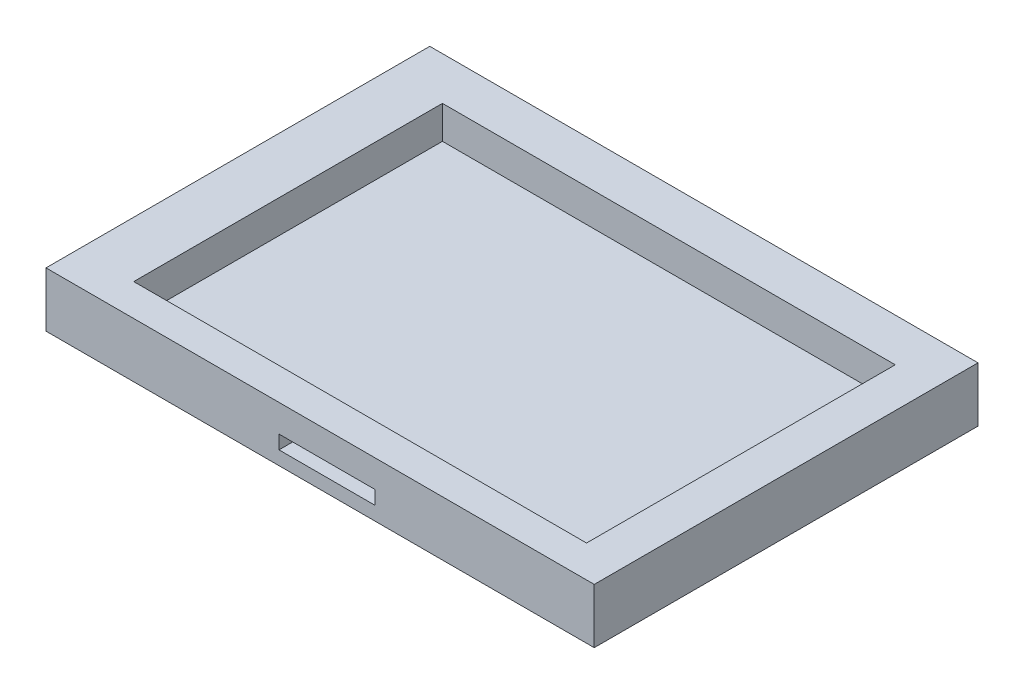
ISO-10303-21;
HEADER;
FILE_DESCRIPTION(('STEP AP214'),'2;1');
FILE_NAME('part.step','',(''),(''),'','','');
FILE_SCHEMA(('AUTOMOTIVE_DESIGN { 1 0 10303 214 1 1 1 1 }'));
ENDSEC;
DATA;
#1=APPLICATION_CONTEXT('core data for automotive mechanical design processes');
#2=APPLICATION_PROTOCOL_DEFINITION('international standard','automotive_design',2000,#1);
#3=PRODUCT_CONTEXT('',#1,'mechanical');
#4=PRODUCT('Part','Part','',(#3));
#5=PRODUCT_RELATED_PRODUCT_CATEGORY('part','',(#4));
#6=PRODUCT_DEFINITION_FORMATION('','',#4);
#7=PRODUCT_DEFINITION_CONTEXT('part definition',#1,'design');
#8=PRODUCT_DEFINITION('design','',#6,#7);
#9=PRODUCT_DEFINITION_SHAPE('','',#8);
#10=(LENGTH_UNIT() NAMED_UNIT(*) SI_UNIT(.MILLI.,.METRE.));
#11=(NAMED_UNIT(*) PLANE_ANGLE_UNIT() SI_UNIT($,.RADIAN.));
#12=(NAMED_UNIT(*) SI_UNIT($,.STERADIAN.) SOLID_ANGLE_UNIT());
#13=UNCERTAINTY_MEASURE_WITH_UNIT(LENGTH_MEASURE(1.E-05),#10,'distance_accuracy_value','');
#14=(GEOMETRIC_REPRESENTATION_CONTEXT(3) GLOBAL_UNCERTAINTY_ASSIGNED_CONTEXT((#13)) GLOBAL_UNIT_ASSIGNED_CONTEXT((#10,
#11,#12)) REPRESENTATION_CONTEXT('',''));
#15=CARTESIAN_POINT('',(0.,0.,0.));
#16=DIRECTION('',(0.,0.,1.));
#17=DIRECTION('',(1.,0.,0.));
#18=AXIS2_PLACEMENT_3D('',#15,#16,#17);
#19=CARTESIAN_POINT('',(250.,20.,-175.));
#20=DIRECTION('',(-1.,0.,0.));
#21=DIRECTION('',(0.,0.,1.));
#22=AXIS2_PLACEMENT_3D('',#19,#20,#21);
#23=PLANE('',#22);
#24=DIRECTION('',(0.,0.,-1.));
#25=VECTOR('',#24,1.);
#26=CARTESIAN_POINT('',(250.,0.,-175.));
#27=LINE('',#26,#25);
#28=CARTESIAN_POINT('',(250.,0.,175.));
#29=VERTEX_POINT('',#28);
#30=CARTESIAN_POINT('',(250.,0.,-175.));
#31=VERTEX_POINT('',#30);
#32=EDGE_CURVE('E199',#29,#31,#27,.T.);
#33=ORIENTED_EDGE('',*,*,#32,.T.);
#34=DIRECTION('',(0.,-1.,0.));
#35=VECTOR('',#34,1.);
#36=CARTESIAN_POINT('',(250.,20.,-175.));
#37=LINE('',#36,#35);
#38=CARTESIAN_POINT('',(250.,50.,-175.));
#39=VERTEX_POINT('',#38);
#40=EDGE_CURVE('E11',#39,#31,#37,.T.);
#41=ORIENTED_EDGE('',*,*,#40,.F.);
#42=DIRECTION('',(0.,0.,-1.));
#43=VECTOR('',#42,1.);
#44=CARTESIAN_POINT('',(250.,50.,-135.72099100408));
#45=LINE('',#44,#43);
#46=CARTESIAN_POINT('',(250.,50.,175.));
#47=VERTEX_POINT('',#46);
#48=EDGE_CURVE('E193',#47,#39,#45,.T.);
#49=ORIENTED_EDGE('',*,*,#48,.F.);
#50=DIRECTION('',(0.,-1.,0.));
#51=VECTOR('',#50,1.);
#52=CARTESIAN_POINT('',(250.,20.,175.));
#53=LINE('',#52,#51);
#54=EDGE_CURVE('E208',#47,#29,#53,.T.);
#55=ORIENTED_EDGE('',*,*,#54,.T.);
#56=EDGE_LOOP('',(#33,#41,#49,#55));
#57=FACE_BOUND('',#56,.T.);
#58=ADVANCED_FACE('F33',(#57),#23,.F.);
#59=CARTESIAN_POINT('',(-250.,20.,-175.));
#60=DIRECTION('',(0.,0.,1.));
#61=DIRECTION('',(1.,0.,0.));
#62=AXIS2_PLACEMENT_3D('',#59,#60,#61);
#63=PLANE('',#62);
#64=DIRECTION('',(-1.,0.,0.));
#65=VECTOR('',#64,1.);
#66=CARTESIAN_POINT('',(-250.,0.,-175.));
#67=LINE('',#66,#65);
#68=CARTESIAN_POINT('',(-250.,0.,-175.));
#69=VERTEX_POINT('',#68);
#70=EDGE_CURVE('E202',#31,#69,#67,.T.);
#71=ORIENTED_EDGE('',*,*,#70,.T.);
#72=DIRECTION('',(0.,-1.,0.));
#73=VECTOR('',#72,1.);
#74=CARTESIAN_POINT('',(-250.,20.,-175.));
#75=LINE('',#74,#73);
#76=CARTESIAN_POINT('',(-250.,50.,-175.));
#77=VERTEX_POINT('',#76);
#78=EDGE_CURVE('E40',#77,#69,#75,.T.);
#79=ORIENTED_EDGE('',*,*,#78,.F.);
#80=DIRECTION('',(-1.,0.,0.));
#81=VECTOR('',#80,1.);
#82=CARTESIAN_POINT('',(-199.158549182896,50.,-175.));
#83=LINE('',#82,#81);
#84=EDGE_CURVE('E196',#39,#77,#83,.T.);
#85=ORIENTED_EDGE('',*,*,#84,.F.);
#86=ORIENTED_EDGE('',*,*,#40,.T.);
#87=EDGE_LOOP('',(#71,#79,#85,#86));
#88=FACE_BOUND('',#87,.T.);
#89=ADVANCED_FACE('F232',(#88),#63,.F.);
#90=CARTESIAN_POINT('',(-250.,20.,-175.));
#91=DIRECTION('',(1.,0.,0.));
#92=DIRECTION('',(0.,0.,-1.));
#93=AXIS2_PLACEMENT_3D('',#90,#91,#92);
#94=PLANE('',#93);
#95=DIRECTION('',(0.,0.,1.));
#96=VECTOR('',#95,1.);
#97=CARTESIAN_POINT('',(-250.,0.,-175.));
#98=LINE('',#97,#96);
#99=CARTESIAN_POINT('',(-250.,0.,175.));
#100=VERTEX_POINT('',#99);
#101=EDGE_CURVE('E204',#69,#100,#98,.T.);
#102=ORIENTED_EDGE('',*,*,#101,.T.);
#103=DIRECTION('',(0.,-1.,0.));
#104=VECTOR('',#103,1.);
#105=CARTESIAN_POINT('',(-250.,20.,175.));
#106=LINE('',#105,#104);
#107=CARTESIAN_POINT('',(-250.,50.,175.));
#108=VERTEX_POINT('',#107);
#109=EDGE_CURVE('E211',#108,#100,#106,.T.);
#110=ORIENTED_EDGE('',*,*,#109,.F.);
#111=DIRECTION('',(0.,0.,1.));
#112=VECTOR('',#111,1.);
#113=CARTESIAN_POINT('',(-250.,50.,-175.));
#114=LINE('',#113,#112);
#115=EDGE_CURVE('E187',#77,#108,#114,.T.);
#116=ORIENTED_EDGE('',*,*,#115,.F.);
#117=ORIENTED_EDGE('',*,*,#78,.T.);
#118=EDGE_LOOP('',(#102,#110,#116,#117));
#119=FACE_BOUND('',#118,.T.);
#120=ADVANCED_FACE('F217',(#119),#94,.F.);
#121=CARTESIAN_POINT('',(-250.,20.,175.));
#122=DIRECTION('',(0.,0.,-1.));
#123=DIRECTION('',(-1.,0.,0.));
#124=AXIS2_PLACEMENT_3D('',#121,#122,#123);
#125=PLANE('',#124);
#126=DIRECTION('',(1.,0.,0.));
#127=VECTOR('',#126,1.);
#128=CARTESIAN_POINT('',(-37.5,12.5,175.));
#129=LINE('',#128,#127);
#130=CARTESIAN_POINT('',(-37.5,12.5,175.));
#131=VERTEX_POINT('',#130);
#132=CARTESIAN_POINT('',(50.,12.5,175.));
#133=VERTEX_POINT('',#132);
#134=EDGE_CURVE('E150',#131,#133,#129,.T.);
#135=ORIENTED_EDGE('',*,*,#134,.F.);
#136=DIRECTION('',(0.,-1.,0.));
#137=VECTOR('',#136,1.);
#138=CARTESIAN_POINT('',(-37.5,25.,175.));
#139=LINE('',#138,#137);
#140=CARTESIAN_POINT('',(-37.5,25.,175.));
#141=VERTEX_POINT('',#140);
#142=EDGE_CURVE('E47',#141,#131,#139,.T.);
#143=ORIENTED_EDGE('',*,*,#142,.F.);
#144=DIRECTION('',(-1.,0.,0.));
#145=VECTOR('',#144,1.);
#146=CARTESIAN_POINT('',(-37.5,25.,175.));
#147=LINE('',#146,#145);
#148=CARTESIAN_POINT('',(50.,25.,175.));
#149=VERTEX_POINT('',#148);
#150=EDGE_CURVE('E141',#149,#141,#147,.T.);
#151=ORIENTED_EDGE('',*,*,#150,.F.);
#152=DIRECTION('',(0.,1.,0.));
#153=VECTOR('',#152,1.);
#154=CARTESIAN_POINT('',(50.,25.,175.));
#155=LINE('',#154,#153);
#156=EDGE_CURVE('E144',#133,#149,#155,.T.);
#157=ORIENTED_EDGE('',*,*,#156,.F.);
#158=EDGE_LOOP('',(#135,#143,#151,#157));
#159=FACE_BOUND('',#158,.T.);
#160=DIRECTION('',(1.,0.,0.));
#161=VECTOR('',#160,1.);
#162=CARTESIAN_POINT('',(-250.,0.,175.));
#163=LINE('',#162,#161);
#164=EDGE_CURVE('E206',#100,#29,#163,.T.);
#165=ORIENTED_EDGE('',*,*,#164,.T.);
#166=ORIENTED_EDGE('',*,*,#54,.F.);
#167=DIRECTION('',(1.,0.,0.));
#168=VECTOR('',#167,1.);
#169=CARTESIAN_POINT('',(-250.,50.,175.));
#170=LINE('',#169,#168);
#171=EDGE_CURVE('E190',#108,#47,#170,.T.);
#172=ORIENTED_EDGE('',*,*,#171,.F.);
#173=ORIENTED_EDGE('',*,*,#109,.T.);
#174=EDGE_LOOP('',(#165,#166,#172,#173));
#175=FACE_BOUND('',#174,.T.);
#176=ADVANCED_FACE('F225',(#159,#175),#125,.F.);
#177=CARTESIAN_POINT('',(0.,0.,0.));
#178=DIRECTION('',(0.,1.,0.));
#179=DIRECTION('',(0.,0.,1.));
#180=AXIS2_PLACEMENT_3D('',#177,#178,#179);
#181=PLANE('',#180);
#182=ORIENTED_EDGE('',*,*,#32,.F.);
#183=ORIENTED_EDGE('',*,*,#164,.F.);
#184=ORIENTED_EDGE('',*,*,#101,.F.);
#185=ORIENTED_EDGE('',*,*,#70,.F.);
#186=EDGE_LOOP('',(#182,#183,#184,#185));
#187=FACE_BOUND('',#186,.T.);
#188=ADVANCED_FACE('F223',(#187),#181,.F.);
#189=CARTESIAN_POINT('',(0.,50.,0.));
#190=DIRECTION('',(0.,1.,0.));
#191=DIRECTION('',(0.,0.,1.));
#192=AXIS2_PLACEMENT_3D('',#189,#190,#191);
#193=PLANE('',#192);
#194=ORIENTED_EDGE('',*,*,#115,.T.);
#195=ORIENTED_EDGE('',*,*,#171,.T.);
#196=ORIENTED_EDGE('',*,*,#48,.T.);
#197=ORIENTED_EDGE('',*,*,#84,.T.);
#198=EDGE_LOOP('',(#194,#195,#196,#197));
#199=FACE_BOUND('',#198,.T.);
#200=DIRECTION('',(0.,0.,1.));
#201=VECTOR('',#200,1.);
#202=CARTESIAN_POINT('',(-199.158549182896,50.,-135.72099100408));
#203=LINE('',#202,#201);
#204=CARTESIAN_POINT('',(-199.158549182896,50.,-135.72099100408));
#205=VERTEX_POINT('',#204);
#206=CARTESIAN_POINT('',(-199.158549182896,50.,145.830562028592));
#207=VERTEX_POINT('',#206);
#208=EDGE_CURVE('E161',#205,#207,#203,.T.);
#209=ORIENTED_EDGE('',*,*,#208,.F.);
#210=DIRECTION('',(-1.,0.,0.));
#211=VECTOR('',#210,1.);
#212=CARTESIAN_POINT('',(-199.158549182896,50.,-135.72099100408));
#213=LINE('',#212,#211);
#214=CARTESIAN_POINT('',(213.817427168439,50.,-135.72099100408));
#215=VERTEX_POINT('',#214);
#216=EDGE_CURVE('E159',#215,#205,#213,.T.);
#217=ORIENTED_EDGE('',*,*,#216,.F.);
#218=DIRECTION('',(0.,0.,-1.));
#219=VECTOR('',#218,1.);
#220=CARTESIAN_POINT('',(213.817427168439,50.,-135.72099100408));
#221=LINE('',#220,#219);
#222=CARTESIAN_POINT('',(213.817427168439,50.,145.830562028592));
#223=VERTEX_POINT('',#222);
#224=EDGE_CURVE('E167',#223,#215,#221,.T.);
#225=ORIENTED_EDGE('',*,*,#224,.F.);
#226=DIRECTION('',(1.,0.,0.));
#227=VECTOR('',#226,1.);
#228=CARTESIAN_POINT('',(-199.158549182896,50.,145.830562028592));
#229=LINE('',#228,#227);
#230=EDGE_CURVE('E164',#207,#223,#229,.T.);
#231=ORIENTED_EDGE('',*,*,#230,.F.);
#232=EDGE_LOOP('',(#209,#217,#225,#231));
#233=FACE_BOUND('',#232,.T.);
#234=ADVANCED_FACE('F230',(#199,#233),#193,.T.);
#235=CARTESIAN_POINT('',(-199.158549182896,50.,-135.72099100408));
#236=DIRECTION('',(0.,0.,1.));
#237=DIRECTION('',(1.,0.,0.));
#238=AXIS2_PLACEMENT_3D('',#235,#236,#237);
#239=PLANE('',#238);
#240=DIRECTION('',(-1.,0.,0.));
#241=VECTOR('',#240,1.);
#242=CARTESIAN_POINT('',(-199.158549182896,20.,-135.72099100408));
#243=LINE('',#242,#241);
#244=CARTESIAN_POINT('',(213.817427168439,20.,-135.72099100408));
#245=VERTEX_POINT('',#244);
#246=CARTESIAN_POINT('',(-199.158549182896,20.,-135.72099100408));
#247=VERTEX_POINT('',#246);
#248=EDGE_CURVE('E55',#245,#247,#243,.T.);
#249=ORIENTED_EDGE('',*,*,#248,.F.);
#250=DIRECTION('',(0.,-1.,0.));
#251=VECTOR('',#250,1.);
#252=CARTESIAN_POINT('',(213.817427168439,50.,-135.72099100408));
#253=LINE('',#252,#251);
#254=EDGE_CURVE('E169',#215,#245,#253,.T.);
#255=ORIENTED_EDGE('',*,*,#254,.F.);
#256=ORIENTED_EDGE('',*,*,#216,.T.);
#257=DIRECTION('',(0.,-1.,0.));
#258=VECTOR('',#257,1.);
#259=CARTESIAN_POINT('',(-199.158549182896,50.,-135.72099100408));
#260=LINE('',#259,#258);
#261=EDGE_CURVE('E184',#205,#247,#260,.T.);
#262=ORIENTED_EDGE('',*,*,#261,.T.);
#263=EDGE_LOOP('',(#249,#255,#256,#262));
#264=FACE_BOUND('',#263,.T.);
#265=ADVANCED_FACE('F251',(#264),#239,.T.);
#266=CARTESIAN_POINT('',(-199.158549182896,50.,-135.72099100408));
#267=DIRECTION('',(1.,0.,0.));
#268=DIRECTION('',(0.,0.,-1.));
#269=AXIS2_PLACEMENT_3D('',#266,#267,#268);
#270=PLANE('',#269);
#271=DIRECTION('',(0.,0.,1.));
#272=VECTOR('',#271,1.);
#273=CARTESIAN_POINT('',(-199.158549182896,20.,-135.72099100408));
#274=LINE('',#273,#272);
#275=CARTESIAN_POINT('',(-199.158549182896,20.,145.830562028592));
#276=VERTEX_POINT('',#275);
#277=EDGE_CURVE('E171',#247,#276,#274,.T.);
#278=ORIENTED_EDGE('',*,*,#277,.F.);
#279=ORIENTED_EDGE('',*,*,#261,.F.);
#280=ORIENTED_EDGE('',*,*,#208,.T.);
#281=DIRECTION('',(0.,-1.,0.));
#282=VECTOR('',#281,1.);
#283=CARTESIAN_POINT('',(-199.158549182896,50.,145.830562028592));
#284=LINE('',#283,#282);
#285=EDGE_CURVE('E181',#207,#276,#284,.T.);
#286=ORIENTED_EDGE('',*,*,#285,.T.);
#287=EDGE_LOOP('',(#278,#279,#280,#286));
#288=FACE_BOUND('',#287,.T.);
#289=ADVANCED_FACE('F254',(#288),#270,.T.);
#290=CARTESIAN_POINT('',(-199.158549182896,50.,145.830562028592));
#291=DIRECTION('',(0.,0.,-1.));
#292=DIRECTION('',(-1.,0.,0.));
#293=AXIS2_PLACEMENT_3D('',#290,#291,#292);
#294=PLANE('',#293);
#295=DIRECTION('',(1.,0.,0.));
#296=VECTOR('',#295,1.);
#297=CARTESIAN_POINT('',(-199.158549182896,20.,145.830562028592));
#298=LINE('',#297,#296);
#299=CARTESIAN_POINT('',(213.817427168439,20.,145.830562028592));
#300=VERTEX_POINT('',#299);
#301=EDGE_CURVE('E173',#276,#300,#298,.T.);
#302=ORIENTED_EDGE('',*,*,#301,.F.);
#303=ORIENTED_EDGE('',*,*,#285,.F.);
#304=ORIENTED_EDGE('',*,*,#230,.T.);
#305=DIRECTION('',(0.,-1.,0.));
#306=VECTOR('',#305,1.);
#307=CARTESIAN_POINT('',(213.817427168439,50.,145.830562028592));
#308=LINE('',#307,#306);
#309=EDGE_CURVE('E178',#223,#300,#308,.T.);
#310=ORIENTED_EDGE('',*,*,#309,.T.);
#311=EDGE_LOOP('',(#302,#303,#304,#310));
#312=FACE_BOUND('',#311,.T.);
#313=ADVANCED_FACE('F258',(#312),#294,.T.);
#314=CARTESIAN_POINT('',(213.817427168439,50.,-135.72099100408));
#315=DIRECTION('',(-1.,0.,0.));
#316=DIRECTION('',(0.,0.,1.));
#317=AXIS2_PLACEMENT_3D('',#314,#315,#316);
#318=PLANE('',#317);
#319=DIRECTION('',(0.,0.,-1.));
#320=VECTOR('',#319,1.);
#321=CARTESIAN_POINT('',(213.817427168439,20.,-135.72099100408));
#322=LINE('',#321,#320);
#323=EDGE_CURVE('E162',#300,#245,#322,.T.);
#324=ORIENTED_EDGE('',*,*,#323,.F.);
#325=ORIENTED_EDGE('',*,*,#309,.F.);
#326=ORIENTED_EDGE('',*,*,#224,.T.);
#327=ORIENTED_EDGE('',*,*,#254,.T.);
#328=EDGE_LOOP('',(#324,#325,#326,#327));
#329=FACE_BOUND('',#328,.T.);
#330=ADVANCED_FACE('F248',(#329),#318,.T.);
#331=CARTESIAN_POINT('',(0.,20.,0.));
#332=DIRECTION('',(0.,1.,0.));
#333=DIRECTION('',(0.,0.,1.));
#334=AXIS2_PLACEMENT_3D('',#331,#332,#333);
#335=PLANE('',#334);
#336=ORIENTED_EDGE('',*,*,#248,.T.);
#337=ORIENTED_EDGE('',*,*,#277,.T.);
#338=ORIENTED_EDGE('',*,*,#301,.T.);
#339=ORIENTED_EDGE('',*,*,#323,.T.);
#340=EDGE_LOOP('',(#336,#337,#338,#339));
#341=FACE_BOUND('',#340,.T.);
#342=ADVANCED_FACE('F245',(#341),#335,.T.);
#343=CARTESIAN_POINT('',(-37.5,25.,155.));
#344=DIRECTION('',(-1.,0.,0.));
#345=DIRECTION('',(0.,0.,1.));
#346=AXIS2_PLACEMENT_3D('',#343,#344,#345);
#347=PLANE('',#346);
#348=ORIENTED_EDGE('',*,*,#142,.T.);
#349=DIRECTION('',(0.,0.,1.));
#350=VECTOR('',#349,1.);
#351=CARTESIAN_POINT('',(-37.5,12.5,155.));
#352=LINE('',#351,#350);
#353=CARTESIAN_POINT('',(-37.5,12.5,155.));
#354=VERTEX_POINT('',#353);
#355=EDGE_CURVE('E119',#354,#131,#352,.T.);
#356=ORIENTED_EDGE('',*,*,#355,.F.);
#357=DIRECTION('',(0.,-1.,0.));
#358=VECTOR('',#357,1.);
#359=CARTESIAN_POINT('',(-37.5,25.,155.));
#360=LINE('',#359,#358);
#361=CARTESIAN_POINT('',(-37.5,25.,155.));
#362=VERTEX_POINT('',#361);
#363=EDGE_CURVE('E123',#362,#354,#360,.T.);
#364=ORIENTED_EDGE('',*,*,#363,.F.);
#365=DIRECTION('',(0.,0.,1.));
#366=VECTOR('',#365,1.);
#367=CARTESIAN_POINT('',(-37.5,25.,155.));
#368=LINE('',#367,#366);
#369=EDGE_CURVE('E154',#362,#141,#368,.T.);
#370=ORIENTED_EDGE('',*,*,#369,.T.);
#371=EDGE_LOOP('',(#348,#356,#364,#370));
#372=FACE_BOUND('',#371,.T.);
#373=ADVANCED_FACE('F121',(#372),#347,.F.);
#374=CARTESIAN_POINT('',(-37.5,25.,155.));
#375=DIRECTION('',(0.,1.,0.));
#376=DIRECTION('',(0.,0.,1.));
#377=AXIS2_PLACEMENT_3D('',#374,#375,#376);
#378=PLANE('',#377);
#379=ORIENTED_EDGE('',*,*,#150,.T.);
#380=ORIENTED_EDGE('',*,*,#369,.F.);
#381=DIRECTION('',(-1.,0.,0.));
#382=VECTOR('',#381,1.);
#383=CARTESIAN_POINT('',(-37.5,25.,155.));
#384=LINE('',#383,#382);
#385=CARTESIAN_POINT('',(50.,25.,155.));
#386=VERTEX_POINT('',#385);
#387=EDGE_CURVE('E129',#386,#362,#384,.T.);
#388=ORIENTED_EDGE('',*,*,#387,.F.);
#389=DIRECTION('',(0.,0.,1.));
#390=VECTOR('',#389,1.);
#391=CARTESIAN_POINT('',(50.,25.,155.));
#392=LINE('',#391,#390);
#393=EDGE_CURVE('E156',#386,#149,#392,.T.);
#394=ORIENTED_EDGE('',*,*,#393,.T.);
#395=EDGE_LOOP('',(#379,#380,#388,#394));
#396=FACE_BOUND('',#395,.T.);
#397=ADVANCED_FACE('F268',(#396),#378,.F.);
#398=CARTESIAN_POINT('',(50.,25.,155.));
#399=DIRECTION('',(1.,0.,0.));
#400=DIRECTION('',(0.,0.,-1.));
#401=AXIS2_PLACEMENT_3D('',#398,#399,#400);
#402=PLANE('',#401);
#403=ORIENTED_EDGE('',*,*,#156,.T.);
#404=ORIENTED_EDGE('',*,*,#393,.F.);
#405=DIRECTION('',(0.,1.,0.));
#406=VECTOR('',#405,1.);
#407=CARTESIAN_POINT('',(50.,25.,155.));
#408=LINE('',#407,#406);
#409=CARTESIAN_POINT('',(50.,12.5,155.));
#410=VERTEX_POINT('',#409);
#411=EDGE_CURVE('E137',#410,#386,#408,.T.);
#412=ORIENTED_EDGE('',*,*,#411,.F.);
#413=DIRECTION('',(0.,0.,1.));
#414=VECTOR('',#413,1.);
#415=CARTESIAN_POINT('',(50.,12.5,155.));
#416=LINE('',#415,#414);
#417=EDGE_CURVE('E128',#410,#133,#416,.T.);
#418=ORIENTED_EDGE('',*,*,#417,.T.);
#419=EDGE_LOOP('',(#403,#404,#412,#418));
#420=FACE_BOUND('',#419,.T.);
#421=ADVANCED_FACE('F271',(#420),#402,.F.);
#422=CARTESIAN_POINT('',(-37.5,12.5,155.));
#423=DIRECTION('',(0.,-1.,0.));
#424=DIRECTION('',(1.,0.,0.));
#425=AXIS2_PLACEMENT_3D('',#422,#423,#424);
#426=PLANE('',#425);
#427=ORIENTED_EDGE('',*,*,#134,.T.);
#428=ORIENTED_EDGE('',*,*,#417,.F.);
#429=DIRECTION('',(1.,0.,0.));
#430=VECTOR('',#429,1.);
#431=CARTESIAN_POINT('',(-37.5,12.5,155.));
#432=LINE('',#431,#430);
#433=EDGE_CURVE('E132',#354,#410,#432,.T.);
#434=ORIENTED_EDGE('',*,*,#433,.F.);
#435=ORIENTED_EDGE('',*,*,#355,.T.);
#436=EDGE_LOOP('',(#427,#428,#434,#435));
#437=FACE_BOUND('',#436,.T.);
#438=ADVANCED_FACE('F133',(#437),#426,.F.);
#439=CARTESIAN_POINT('',(0.,0.,155.));
#440=DIRECTION('',(0.,0.,1.));
#441=DIRECTION('',(1.,0.,0.));
#442=AXIS2_PLACEMENT_3D('',#439,#440,#441);
#443=PLANE('',#442);
#444=ORIENTED_EDGE('',*,*,#363,.T.);
#445=ORIENTED_EDGE('',*,*,#433,.T.);
#446=ORIENTED_EDGE('',*,*,#411,.T.);
#447=ORIENTED_EDGE('',*,*,#387,.T.);
#448=EDGE_LOOP('',(#444,#445,#446,#447));
#449=FACE_BOUND('',#448,.T.);
#450=ADVANCED_FACE('F139',(#449),#443,.T.);
#451=CLOSED_SHELL('',(#58,#89,#120,#176,#188,#234,#265,#289,#313,#330,#342,#373,#397,#421,#438,#450));
#452=MANIFOLD_SOLID_BREP('B2',#451);
#453=ADVANCED_BREP_SHAPE_REPRESENTATION('',(#18,#452),#14);
#454=SHAPE_DEFINITION_REPRESENTATION(#9,#453);
ENDSEC;
END-ISO-10303-21;
